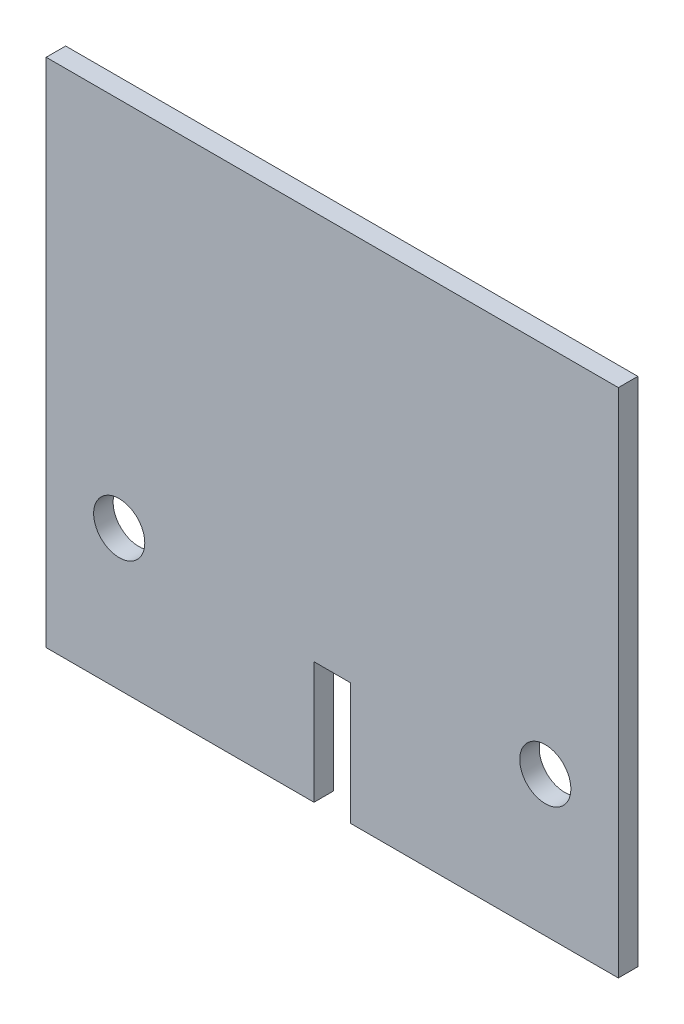
ISO-10303-21;
HEADER;
FILE_DESCRIPTION(('STEP AP214'),'2;1');
FILE_NAME('part.step','',(''),(''),'','','');
FILE_SCHEMA(('AUTOMOTIVE_DESIGN { 1 0 10303 214 1 1 1 1 }'));
ENDSEC;
DATA;
#1=APPLICATION_CONTEXT('core data for automotive mechanical design processes');
#2=APPLICATION_PROTOCOL_DEFINITION('international standard','automotive_design',2000,#1);
#3=PRODUCT_CONTEXT('',#1,'mechanical');
#4=PRODUCT('Part','Part','',(#3));
#5=PRODUCT_RELATED_PRODUCT_CATEGORY('part','',(#4));
#6=PRODUCT_DEFINITION_FORMATION('','',#4);
#7=PRODUCT_DEFINITION_CONTEXT('part definition',#1,'design');
#8=PRODUCT_DEFINITION('design','',#6,#7);
#9=PRODUCT_DEFINITION_SHAPE('','',#8);
#10=(LENGTH_UNIT() NAMED_UNIT(*) SI_UNIT(.MILLI.,.METRE.));
#11=(NAMED_UNIT(*) PLANE_ANGLE_UNIT() SI_UNIT($,.RADIAN.));
#12=(NAMED_UNIT(*) SI_UNIT($,.STERADIAN.) SOLID_ANGLE_UNIT());
#13=UNCERTAINTY_MEASURE_WITH_UNIT(LENGTH_MEASURE(1.E-05),#10,'distance_accuracy_value','');
#14=(GEOMETRIC_REPRESENTATION_CONTEXT(3) GLOBAL_UNCERTAINTY_ASSIGNED_CONTEXT((#13)) GLOBAL_UNIT_ASSIGNED_CONTEXT((#10,
#11,#12)) REPRESENTATION_CONTEXT('',''));
#15=CARTESIAN_POINT('',(0.,0.,0.));
#16=DIRECTION('',(0.,0.,1.));
#17=DIRECTION('',(1.,0.,0.));
#18=AXIS2_PLACEMENT_3D('',#15,#16,#17);
#19=CARTESIAN_POINT('',(23.5,19.5353535353535,0.));
#20=DIRECTION('',(0.,0.,1.));
#21=DIRECTION('',(1.,0.,0.));
#22=AXIS2_PLACEMENT_3D('',#19,#20,#21);
#23=PLANE('',#22);
#24=CARTESIAN_POINT('',(6.,11.5,0.));
#25=DIRECTION('',(0.,0.,1.));
#26=DIRECTION('',(1.,0.,0.));
#27=AXIS2_PLACEMENT_3D('',#24,#25,#26);
#28=CIRCLE('',#27,2.1);
#29=CARTESIAN_POINT('',(8.1,11.5,0.));
#30=VERTEX_POINT('',#29);
#31=EDGE_CURVE('E108',#30,#30,#28,.T.);
#32=ORIENTED_EDGE('',*,*,#31,.T.);
#33=EDGE_LOOP('',(#32));
#34=FACE_BOUND('',#33,.T.);
#35=CARTESIAN_POINT('',(41.,11.5,0.));
#36=DIRECTION('',(0.,0.,1.));
#37=DIRECTION('',(1.,0.,0.));
#38=AXIS2_PLACEMENT_3D('',#35,#36,#37);
#39=CIRCLE('',#38,2.1);
#40=CARTESIAN_POINT('',(43.1,11.5,0.));
#41=VERTEX_POINT('',#40);
#42=EDGE_CURVE('E20',#41,#41,#39,.T.);
#43=ORIENTED_EDGE('',*,*,#42,.T.);
#44=EDGE_LOOP('',(#43));
#45=FACE_BOUND('',#44,.T.);
#46=DIRECTION('',(1.,0.,0.));
#47=VECTOR('',#46,1.);
#48=CARTESIAN_POINT('',(0.,42.,0.));
#49=LINE('',#48,#47);
#50=CARTESIAN_POINT('',(47.,42.,0.));
#51=VERTEX_POINT('',#50);
#52=CARTESIAN_POINT('',(0.,42.,0.));
#53=VERTEX_POINT('',#52);
#54=EDGE_CURVE('E84',#51,#53,#49,.F.);
#55=ORIENTED_EDGE('',*,*,#54,.F.);
#56=DIRECTION('',(0.,1.,0.));
#57=VECTOR('',#56,1.);
#58=CARTESIAN_POINT('',(47.,42.,0.));
#59=LINE('',#58,#57);
#60=CARTESIAN_POINT('',(47.,0.,0.));
#61=VERTEX_POINT('',#60);
#62=EDGE_CURVE('E117',#61,#51,#59,.T.);
#63=ORIENTED_EDGE('',*,*,#62,.F.);
#64=DIRECTION('',(1.,0.,0.));
#65=VECTOR('',#64,1.);
#66=CARTESIAN_POINT('',(47.,0.,0.));
#67=LINE('',#66,#65);
#68=CARTESIAN_POINT('',(25.,0.,0.));
#69=VERTEX_POINT('',#68);
#70=EDGE_CURVE('E125',#69,#61,#67,.T.);
#71=ORIENTED_EDGE('',*,*,#70,.F.);
#72=DIRECTION('',(0.,1.,0.));
#73=VECTOR('',#72,1.);
#74=CARTESIAN_POINT('',(25.,0.,0.));
#75=LINE('',#74,#73);
#76=CARTESIAN_POINT('',(25.,10.,0.));
#77=VERTEX_POINT('',#76);
#78=EDGE_CURVE('E130',#77,#69,#75,.F.);
#79=ORIENTED_EDGE('',*,*,#78,.F.);
#80=DIRECTION('',(1.,0.,0.));
#81=VECTOR('',#80,1.);
#82=CARTESIAN_POINT('',(25.,10.,0.));
#83=LINE('',#82,#81);
#84=CARTESIAN_POINT('',(22.,10.,0.));
#85=VERTEX_POINT('',#84);
#86=EDGE_CURVE('E135',#85,#77,#83,.T.);
#87=ORIENTED_EDGE('',*,*,#86,.F.);
#88=DIRECTION('',(0.,1.,0.));
#89=VECTOR('',#88,1.);
#90=CARTESIAN_POINT('',(22.,10.,0.));
#91=LINE('',#90,#89);
#92=CARTESIAN_POINT('',(22.,0.,0.));
#93=VERTEX_POINT('',#92);
#94=EDGE_CURVE('E140',#93,#85,#91,.T.);
#95=ORIENTED_EDGE('',*,*,#94,.F.);
#96=DIRECTION('',(1.,0.,0.));
#97=VECTOR('',#96,1.);
#98=CARTESIAN_POINT('',(22.,0.,0.));
#99=LINE('',#98,#97);
#100=CARTESIAN_POINT('',(0.,0.,0.));
#101=VERTEX_POINT('',#100);
#102=EDGE_CURVE('E95',#101,#93,#99,.T.);
#103=ORIENTED_EDGE('',*,*,#102,.F.);
#104=DIRECTION('',(0.,1.,0.));
#105=VECTOR('',#104,1.);
#106=CARTESIAN_POINT('',(0.,0.,0.));
#107=LINE('',#106,#105);
#108=EDGE_CURVE('E79',#53,#101,#107,.F.);
#109=ORIENTED_EDGE('',*,*,#108,.F.);
#110=EDGE_LOOP('',(#55,#63,#71,#79,#87,#95,#103,#109));
#111=FACE_BOUND('',#110,.T.);
#112=ADVANCED_FACE('F17',(#34,#45,#111),#23,.F.);
#113=CARTESIAN_POINT('',(0.,42.,0.));
#114=DIRECTION('',(0.,1.,0.));
#115=DIRECTION('',(0.,0.,1.));
#116=AXIS2_PLACEMENT_3D('',#113,#114,#115);
#117=PLANE('',#116);
#118=ORIENTED_EDGE('',*,*,#54,.T.);
#119=DIRECTION('',(0.,0.,1.));
#120=VECTOR('',#119,1.);
#121=CARTESIAN_POINT('',(0.,42.,0.));
#122=LINE('',#121,#120);
#123=CARTESIAN_POINT('',(0.,42.,1.6));
#124=VERTEX_POINT('',#123);
#125=EDGE_CURVE('E86',#124,#53,#122,.F.);
#126=ORIENTED_EDGE('',*,*,#125,.F.);
#127=DIRECTION('',(1.,0.,0.));
#128=VECTOR('',#127,1.);
#129=CARTESIAN_POINT('',(23.5,42.,1.6));
#130=LINE('',#129,#128);
#131=CARTESIAN_POINT('',(47.,42.,1.6));
#132=VERTEX_POINT('',#131);
#133=EDGE_CURVE('E110',#132,#124,#130,.F.);
#134=ORIENTED_EDGE('',*,*,#133,.F.);
#135=DIRECTION('',(0.,0.,-1.));
#136=VECTOR('',#135,1.);
#137=CARTESIAN_POINT('',(47.,42.,0.));
#138=LINE('',#137,#136);
#139=EDGE_CURVE('E89',#51,#132,#138,.F.);
#140=ORIENTED_EDGE('',*,*,#139,.F.);
#141=EDGE_LOOP('',(#118,#126,#134,#140));
#142=FACE_BOUND('',#141,.T.);
#143=ADVANCED_FACE('F85',(#142),#117,.T.);
#144=CARTESIAN_POINT('',(0.,0.,0.));
#145=DIRECTION('',(-1.,0.,0.));
#146=DIRECTION('',(0.,0.,1.));
#147=AXIS2_PLACEMENT_3D('',#144,#145,#146);
#148=PLANE('',#147);
#149=ORIENTED_EDGE('',*,*,#108,.T.);
#150=DIRECTION('',(0.,0.,-1.));
#151=VECTOR('',#150,1.);
#152=CARTESIAN_POINT('',(0.,0.,0.));
#153=LINE('',#152,#151);
#154=CARTESIAN_POINT('',(0.,0.,1.6));
#155=VERTEX_POINT('',#154);
#156=EDGE_CURVE('E97',#155,#101,#153,.T.);
#157=ORIENTED_EDGE('',*,*,#156,.F.);
#158=DIRECTION('',(0.,1.,0.));
#159=VECTOR('',#158,1.);
#160=CARTESIAN_POINT('',(0.,19.5353535353535,1.6));
#161=LINE('',#160,#159);
#162=EDGE_CURVE('E101',#124,#155,#161,.F.);
#163=ORIENTED_EDGE('',*,*,#162,.F.);
#164=ORIENTED_EDGE('',*,*,#125,.T.);
#165=EDGE_LOOP('',(#149,#157,#163,#164));
#166=FACE_BOUND('',#165,.T.);
#167=ADVANCED_FACE('F99',(#166),#148,.T.);
#168=CARTESIAN_POINT('',(22.,0.,0.));
#169=DIRECTION('',(0.,-1.,0.));
#170=DIRECTION('',(0.,0.,-1.));
#171=AXIS2_PLACEMENT_3D('',#168,#169,#170);
#172=PLANE('',#171);
#173=ORIENTED_EDGE('',*,*,#102,.T.);
#174=DIRECTION('',(0.,0.,-1.));
#175=VECTOR('',#174,1.);
#176=CARTESIAN_POINT('',(22.,0.,0.));
#177=LINE('',#176,#175);
#178=CARTESIAN_POINT('',(22.,0.,1.6));
#179=VERTEX_POINT('',#178);
#180=EDGE_CURVE('E142',#179,#93,#177,.T.);
#181=ORIENTED_EDGE('',*,*,#180,.F.);
#182=DIRECTION('',(1.,0.,0.));
#183=VECTOR('',#182,1.);
#184=CARTESIAN_POINT('',(23.5,0.,1.6));
#185=LINE('',#184,#183);
#186=EDGE_CURVE('E149',#155,#179,#185,.T.);
#187=ORIENTED_EDGE('',*,*,#186,.F.);
#188=ORIENTED_EDGE('',*,*,#156,.T.);
#189=EDGE_LOOP('',(#173,#181,#187,#188));
#190=FACE_BOUND('',#189,.T.);
#191=ADVANCED_FACE('F147',(#190),#172,.T.);
#192=CARTESIAN_POINT('',(22.,10.,0.));
#193=DIRECTION('',(1.,0.,0.));
#194=DIRECTION('',(0.,0.,-1.));
#195=AXIS2_PLACEMENT_3D('',#192,#193,#194);
#196=PLANE('',#195);
#197=ORIENTED_EDGE('',*,*,#94,.T.);
#198=DIRECTION('',(0.,0.,-1.));
#199=VECTOR('',#198,1.);
#200=CARTESIAN_POINT('',(22.,10.,0.));
#201=LINE('',#200,#199);
#202=CARTESIAN_POINT('',(22.,10.,1.6));
#203=VERTEX_POINT('',#202);
#204=EDGE_CURVE('E137',#203,#85,#201,.T.);
#205=ORIENTED_EDGE('',*,*,#204,.F.);
#206=DIRECTION('',(0.,1.,0.));
#207=VECTOR('',#206,1.);
#208=CARTESIAN_POINT('',(22.,19.5353535353535,1.6));
#209=LINE('',#208,#207);
#210=EDGE_CURVE('E153',#179,#203,#209,.T.);
#211=ORIENTED_EDGE('',*,*,#210,.F.);
#212=ORIENTED_EDGE('',*,*,#180,.T.);
#213=EDGE_LOOP('',(#197,#205,#211,#212));
#214=FACE_BOUND('',#213,.T.);
#215=ADVANCED_FACE('F179',(#214),#196,.T.);
#216=CARTESIAN_POINT('',(25.,10.,0.));
#217=DIRECTION('',(0.,-1.,0.));
#218=DIRECTION('',(0.,0.,-1.));
#219=AXIS2_PLACEMENT_3D('',#216,#217,#218);
#220=PLANE('',#219);
#221=ORIENTED_EDGE('',*,*,#86,.T.);
#222=DIRECTION('',(0.,0.,1.));
#223=VECTOR('',#222,1.);
#224=CARTESIAN_POINT('',(25.,10.,0.));
#225=LINE('',#224,#223);
#226=CARTESIAN_POINT('',(25.,10.,1.6));
#227=VERTEX_POINT('',#226);
#228=EDGE_CURVE('E132',#227,#77,#225,.F.);
#229=ORIENTED_EDGE('',*,*,#228,.F.);
#230=DIRECTION('',(1.,0.,0.));
#231=VECTOR('',#230,1.);
#232=CARTESIAN_POINT('',(23.5,10.,1.6));
#233=LINE('',#232,#231);
#234=EDGE_CURVE('E159',#203,#227,#233,.T.);
#235=ORIENTED_EDGE('',*,*,#234,.F.);
#236=ORIENTED_EDGE('',*,*,#204,.T.);
#237=EDGE_LOOP('',(#221,#229,#235,#236));
#238=FACE_BOUND('',#237,.T.);
#239=ADVANCED_FACE('F177',(#238),#220,.T.);
#240=CARTESIAN_POINT('',(25.,0.,0.));
#241=DIRECTION('',(-1.,0.,0.));
#242=DIRECTION('',(0.,0.,1.));
#243=AXIS2_PLACEMENT_3D('',#240,#241,#242);
#244=PLANE('',#243);
#245=ORIENTED_EDGE('',*,*,#78,.T.);
#246=DIRECTION('',(0.,0.,-1.));
#247=VECTOR('',#246,1.);
#248=CARTESIAN_POINT('',(25.,0.,0.));
#249=LINE('',#248,#247);
#250=CARTESIAN_POINT('',(25.,0.,1.6));
#251=VERTEX_POINT('',#250);
#252=EDGE_CURVE('E127',#251,#69,#249,.T.);
#253=ORIENTED_EDGE('',*,*,#252,.F.);
#254=DIRECTION('',(0.,1.,0.));
#255=VECTOR('',#254,1.);
#256=CARTESIAN_POINT('',(25.,19.5353535353535,1.6));
#257=LINE('',#256,#255);
#258=EDGE_CURVE('E162',#227,#251,#257,.F.);
#259=ORIENTED_EDGE('',*,*,#258,.F.);
#260=ORIENTED_EDGE('',*,*,#228,.T.);
#261=EDGE_LOOP('',(#245,#253,#259,#260));
#262=FACE_BOUND('',#261,.T.);
#263=ADVANCED_FACE('F174',(#262),#244,.T.);
#264=CARTESIAN_POINT('',(47.,0.,0.));
#265=DIRECTION('',(0.,-1.,0.));
#266=DIRECTION('',(0.,0.,-1.));
#267=AXIS2_PLACEMENT_3D('',#264,#265,#266);
#268=PLANE('',#267);
#269=ORIENTED_EDGE('',*,*,#70,.T.);
#270=DIRECTION('',(0.,0.,-1.));
#271=VECTOR('',#270,1.);
#272=CARTESIAN_POINT('',(47.,0.,0.));
#273=LINE('',#272,#271);
#274=CARTESIAN_POINT('',(47.,0.,1.6));
#275=VERTEX_POINT('',#274);
#276=EDGE_CURVE('E35',#275,#61,#273,.T.);
#277=ORIENTED_EDGE('',*,*,#276,.F.);
#278=DIRECTION('',(1.,0.,0.));
#279=VECTOR('',#278,1.);
#280=CARTESIAN_POINT('',(23.5,0.,1.6));
#281=LINE('',#280,#279);
#282=EDGE_CURVE('E165',#251,#275,#281,.T.);
#283=ORIENTED_EDGE('',*,*,#282,.F.);
#284=ORIENTED_EDGE('',*,*,#252,.T.);
#285=EDGE_LOOP('',(#269,#277,#283,#284));
#286=FACE_BOUND('',#285,.T.);
#287=ADVANCED_FACE('F171',(#286),#268,.T.);
#288=CARTESIAN_POINT('',(47.,42.,0.));
#289=DIRECTION('',(1.,0.,0.));
#290=DIRECTION('',(0.,0.,-1.));
#291=AXIS2_PLACEMENT_3D('',#288,#289,#290);
#292=PLANE('',#291);
#293=ORIENTED_EDGE('',*,*,#62,.T.);
#294=ORIENTED_EDGE('',*,*,#139,.T.);
#295=DIRECTION('',(0.,1.,0.));
#296=VECTOR('',#295,1.);
#297=CARTESIAN_POINT('',(47.,19.5353535353535,1.6));
#298=LINE('',#297,#296);
#299=EDGE_CURVE('E107',#275,#132,#298,.T.);
#300=ORIENTED_EDGE('',*,*,#299,.F.);
#301=ORIENTED_EDGE('',*,*,#276,.T.);
#302=EDGE_LOOP('',(#293,#294,#300,#301));
#303=FACE_BOUND('',#302,.T.);
#304=ADVANCED_FACE('F167',(#303),#292,.T.);
#305=CARTESIAN_POINT('',(41.,11.5,0.));
#306=DIRECTION('',(0.,0.,1.));
#307=DIRECTION('',(1.,0.,0.));
#308=AXIS2_PLACEMENT_3D('',#305,#306,#307);
#309=CYLINDRICAL_SURFACE('',#308,2.1);
#310=ORIENTED_EDGE('',*,*,#42,.F.);
#311=EDGE_LOOP('',(#310));
#312=FACE_BOUND('',#311,.T.);
#313=CARTESIAN_POINT('',(41.,11.5,1.6));
#314=DIRECTION('',(0.,0.,1.));
#315=DIRECTION('',(1.,0.,0.));
#316=AXIS2_PLACEMENT_3D('',#313,#314,#315);
#317=CIRCLE('',#316,2.1);
#318=CARTESIAN_POINT('',(43.1,11.5,1.6));
#319=VERTEX_POINT('',#318);
#320=EDGE_CURVE('E26',#319,#319,#317,.F.);
#321=ORIENTED_EDGE('',*,*,#320,.F.);
#322=EDGE_LOOP('',(#321));
#323=FACE_BOUND('',#322,.T.);
#324=ADVANCED_FACE('F196',(#312,#323),#309,.F.);
#325=CARTESIAN_POINT('',(6.,11.5,0.));
#326=DIRECTION('',(0.,0.,1.));
#327=DIRECTION('',(1.,0.,0.));
#328=AXIS2_PLACEMENT_3D('',#325,#326,#327);
#329=CYLINDRICAL_SURFACE('',#328,2.1);
#330=ORIENTED_EDGE('',*,*,#31,.F.);
#331=EDGE_LOOP('',(#330));
#332=FACE_BOUND('',#331,.T.);
#333=CARTESIAN_POINT('',(6.,11.5,1.6));
#334=DIRECTION('',(0.,0.,1.));
#335=DIRECTION('',(1.,0.,0.));
#336=AXIS2_PLACEMENT_3D('',#333,#334,#335);
#337=CIRCLE('',#336,2.1);
#338=CARTESIAN_POINT('',(8.1,11.5,1.6));
#339=VERTEX_POINT('',#338);
#340=EDGE_CURVE('E11',#339,#339,#337,.F.);
#341=ORIENTED_EDGE('',*,*,#340,.F.);
#342=EDGE_LOOP('',(#341));
#343=FACE_BOUND('',#342,.T.);
#344=ADVANCED_FACE('F190',(#332,#343),#329,.F.);
#345=CARTESIAN_POINT('',(23.5,19.5353535353535,1.6));
#346=DIRECTION('',(0.,0.,1.));
#347=DIRECTION('',(1.,0.,0.));
#348=AXIS2_PLACEMENT_3D('',#345,#346,#347);
#349=PLANE('',#348);
#350=ORIENTED_EDGE('',*,*,#340,.T.);
#351=EDGE_LOOP('',(#350));
#352=FACE_BOUND('',#351,.T.);
#353=ORIENTED_EDGE('',*,*,#320,.T.);
#354=EDGE_LOOP('',(#353));
#355=FACE_BOUND('',#354,.T.);
#356=ORIENTED_EDGE('',*,*,#282,.T.);
#357=ORIENTED_EDGE('',*,*,#299,.T.);
#358=ORIENTED_EDGE('',*,*,#133,.T.);
#359=ORIENTED_EDGE('',*,*,#162,.T.);
#360=ORIENTED_EDGE('',*,*,#186,.T.);
#361=ORIENTED_EDGE('',*,*,#210,.T.);
#362=ORIENTED_EDGE('',*,*,#234,.T.);
#363=ORIENTED_EDGE('',*,*,#258,.T.);
#364=EDGE_LOOP('',(#356,#357,#358,#359,#360,#361,#362,#363));
#365=FACE_BOUND('',#364,.T.);
#366=ADVANCED_FACE('F156',(#352,#355,#365),#349,.T.);
#367=CLOSED_SHELL('',(#112,#143,#167,#191,#215,#239,#263,#287,#304,#324,#344,#366));
#368=MANIFOLD_SOLID_BREP('B1',#367);
#369=ADVANCED_BREP_SHAPE_REPRESENTATION('',(#18,#368),#14);
#370=SHAPE_DEFINITION_REPRESENTATION(#9,#369);
ENDSEC;
END-ISO-10303-21;
